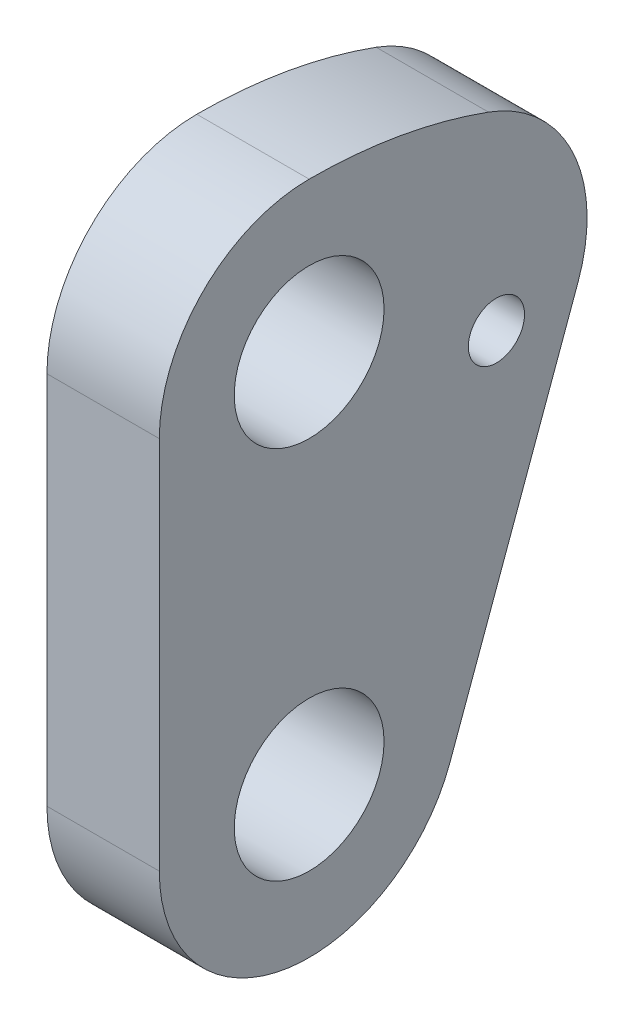
ISO-10303-21;
HEADER;
FILE_DESCRIPTION(('STEP AP214'),'2;1');
FILE_NAME('part.step','',(''),(''),'','','');
FILE_SCHEMA(('AUTOMOTIVE_DESIGN { 1 0 10303 214 1 1 1 1 }'));
ENDSEC;
DATA;
#1=APPLICATION_CONTEXT('core data for automotive mechanical design processes');
#2=APPLICATION_PROTOCOL_DEFINITION('international standard','automotive_design',2000,#1);
#3=PRODUCT_CONTEXT('',#1,'mechanical');
#4=PRODUCT('Part','Part','',(#3));
#5=PRODUCT_RELATED_PRODUCT_CATEGORY('part','',(#4));
#6=PRODUCT_DEFINITION_FORMATION('','',#4);
#7=PRODUCT_DEFINITION_CONTEXT('part definition',#1,'design');
#8=PRODUCT_DEFINITION('design','',#6,#7);
#9=PRODUCT_DEFINITION_SHAPE('','',#8);
#10=(LENGTH_UNIT() NAMED_UNIT(*) SI_UNIT(.MILLI.,.METRE.));
#11=(NAMED_UNIT(*) PLANE_ANGLE_UNIT() SI_UNIT($,.RADIAN.));
#12=(NAMED_UNIT(*) SI_UNIT($,.STERADIAN.) SOLID_ANGLE_UNIT());
#13=UNCERTAINTY_MEASURE_WITH_UNIT(LENGTH_MEASURE(1.E-05),#10,'distance_accuracy_value','');
#14=(GEOMETRIC_REPRESENTATION_CONTEXT(3) GLOBAL_UNCERTAINTY_ASSIGNED_CONTEXT((#13)) GLOBAL_UNIT_ASSIGNED_CONTEXT((#10,
#11,#12)) REPRESENTATION_CONTEXT('',''));
#15=CARTESIAN_POINT('',(0.,0.,0.));
#16=DIRECTION('',(0.,0.,1.));
#17=DIRECTION('',(1.,0.,0.));
#18=AXIS2_PLACEMENT_3D('',#15,#16,#17);
#19=CARTESIAN_POINT('',(3.,9.39692620785908,-3.42020143325669));
#20=DIRECTION('',(1.,0.,0.));
#21=DIRECTION('',(0.,0.,-1.));
#22=AXIS2_PLACEMENT_3D('',#19,#20,#21);
#23=PLANE('',#22);
#24=CARTESIAN_POINT('',(3.,8.,-5.));
#25=DIRECTION('',(1.,0.,0.));
#26=DIRECTION('',(0.,0.,-1.));
#27=AXIS2_PLACEMENT_3D('',#24,#25,#26);
#28=CIRCLE('',#27,0.750000000000001);
#29=CARTESIAN_POINT('',(3.,8.,-5.75));
#30=VERTEX_POINT('',#29);
#31=EDGE_CURVE('E178',#30,#30,#28,.T.);
#32=ORIENTED_EDGE('',*,*,#31,.F.);
#33=EDGE_LOOP('',(#32));
#34=FACE_BOUND('',#33,.T.);
#35=CARTESIAN_POINT('',(3.,0.,0.));
#36=DIRECTION('',(1.,0.,0.));
#37=DIRECTION('',(0.,0.,-1.));
#38=AXIS2_PLACEMENT_3D('',#35,#36,#37);
#39=CIRCLE('',#38,2.);
#40=CARTESIAN_POINT('',(3.,0.,-2.));
#41=VERTEX_POINT('',#40);
#42=EDGE_CURVE('E121',#41,#41,#39,.T.);
#43=ORIENTED_EDGE('',*,*,#42,.F.);
#44=EDGE_LOOP('',(#43));
#45=FACE_BOUND('',#44,.T.);
#46=CARTESIAN_POINT('',(3.,9.39692620785908,-3.42020143325669));
#47=DIRECTION('',(1.,0.,0.));
#48=DIRECTION('',(0.,0.,-1.));
#49=AXIS2_PLACEMENT_3D('',#46,#47,#48);
#50=CIRCLE('',#49,4.);
#51=CARTESIAN_POINT('',(3.,8.0288456345564,-7.17897191640033));
#52=VERTEX_POINT('',#51);
#53=CARTESIAN_POINT('',(3.,13.1556966910027,-4.78828200655937));
#54=VERTEX_POINT('',#53);
#55=EDGE_CURVE('E128',#52,#54,#50,.T.);
#56=ORIENTED_EDGE('',*,*,#55,.T.);
#57=CARTESIAN_POINT('',(3.,0.,0.));
#58=DIRECTION('',(1.,0.,0.));
#59=DIRECTION('',(0.,0.,1.));
#60=AXIS2_PLACEMENT_3D('',#57,#58,#59);
#61=CIRCLE('',#60,14.);
#62=CARTESIAN_POINT('',(3.,14.,0.));
#63=VERTEX_POINT('',#62);
#64=EDGE_CURVE('E86',#54,#63,#61,.T.);
#65=ORIENTED_EDGE('',*,*,#64,.T.);
#66=CARTESIAN_POINT('',(3.,10.,0.));
#67=DIRECTION('',(1.,0.,0.));
#68=DIRECTION('',(0.,0.,-1.));
#69=AXIS2_PLACEMENT_3D('',#66,#67,#68);
#70=CIRCLE('',#69,4.);
#71=CARTESIAN_POINT('',(3.,10.,4.));
#72=VERTEX_POINT('',#71);
#73=EDGE_CURVE('E99',#63,#72,#70,.T.);
#74=ORIENTED_EDGE('',*,*,#73,.T.);
#75=DIRECTION('',(0.,-1.,0.));
#76=VECTOR('',#75,1.);
#77=CARTESIAN_POINT('',(3.,10.,4.));
#78=LINE('',#77,#76);
#79=CARTESIAN_POINT('',(3.,0.,4.));
#80=VERTEX_POINT('',#79);
#81=EDGE_CURVE('E93',#72,#80,#78,.T.);
#82=ORIENTED_EDGE('',*,*,#81,.T.);
#83=CARTESIAN_POINT('',(3.,0.,0.));
#84=DIRECTION('',(1.,0.,0.));
#85=DIRECTION('',(0.,0.,-1.));
#86=AXIS2_PLACEMENT_3D('',#83,#84,#85);
#87=CIRCLE('',#86,4.);
#88=CARTESIAN_POINT('',(3.,-1.36808057330268,-3.75877048314363));
#89=VERTEX_POINT('',#88);
#90=EDGE_CURVE('E97',#80,#89,#87,.T.);
#91=ORIENTED_EDGE('',*,*,#90,.T.);
#92=DIRECTION('',(0.,0.939692620785908,-0.342020143325669));
#93=VECTOR('',#92,1.);
#94=CARTESIAN_POINT('',(3.,-1.36808057330268,-3.75877048314363));
#95=LINE('',#94,#93);
#96=EDGE_CURVE('E49',#89,#52,#95,.T.);
#97=ORIENTED_EDGE('',*,*,#96,.T.);
#98=EDGE_LOOP('',(#56,#65,#74,#82,#91,#97));
#99=FACE_BOUND('',#98,.T.);
#100=CARTESIAN_POINT('',(3.,10.,0.));
#101=DIRECTION('',(1.,0.,0.));
#102=DIRECTION('',(0.,0.,-1.));
#103=AXIS2_PLACEMENT_3D('',#100,#101,#102);
#104=CIRCLE('',#103,2.);
#105=CARTESIAN_POINT('',(3.,10.,-2.));
#106=VERTEX_POINT('',#105);
#107=EDGE_CURVE('E183',#106,#106,#104,.T.);
#108=ORIENTED_EDGE('',*,*,#107,.F.);
#109=EDGE_LOOP('',(#108));
#110=FACE_BOUND('',#109,.T.);
#111=ADVANCED_FACE('F32',(#34,#45,#99,#110),#23,.T.);
#112=CARTESIAN_POINT('',(0.,9.39692620785908,-3.42020143325669));
#113=DIRECTION('',(1.,0.,0.));
#114=DIRECTION('',(0.,0.,-1.));
#115=AXIS2_PLACEMENT_3D('',#112,#113,#114);
#116=PLANE('',#115);
#117=CARTESIAN_POINT('',(0.,8.,-5.));
#118=DIRECTION('',(1.,0.,0.));
#119=DIRECTION('',(0.,0.,-1.));
#120=AXIS2_PLACEMENT_3D('',#117,#118,#119);
#121=CIRCLE('',#120,0.750000000000001);
#122=CARTESIAN_POINT('',(0.,8.,-5.75));
#123=VERTEX_POINT('',#122);
#124=EDGE_CURVE('E176',#123,#123,#121,.T.);
#125=ORIENTED_EDGE('',*,*,#124,.T.);
#126=EDGE_LOOP('',(#125));
#127=FACE_BOUND('',#126,.T.);
#128=CARTESIAN_POINT('',(0.,0.,0.));
#129=DIRECTION('',(1.,0.,0.));
#130=DIRECTION('',(0.,0.,-1.));
#131=AXIS2_PLACEMENT_3D('',#128,#129,#130);
#132=CIRCLE('',#131,2.);
#133=CARTESIAN_POINT('',(0.,0.,-2.));
#134=VERTEX_POINT('',#133);
#135=EDGE_CURVE('E186',#134,#134,#132,.T.);
#136=ORIENTED_EDGE('',*,*,#135,.T.);
#137=EDGE_LOOP('',(#136));
#138=FACE_BOUND('',#137,.T.);
#139=CARTESIAN_POINT('',(0.,9.39692620785908,-3.42020143325669));
#140=DIRECTION('',(1.,0.,0.));
#141=DIRECTION('',(0.,0.,-1.));
#142=AXIS2_PLACEMENT_3D('',#139,#140,#141);
#143=CIRCLE('',#142,4.);
#144=CARTESIAN_POINT('',(0.,8.0288456345564,-7.17897191640033));
#145=VERTEX_POINT('',#144);
#146=CARTESIAN_POINT('',(0.,13.1556966910027,-4.78828200655937));
#147=VERTEX_POINT('',#146);
#148=EDGE_CURVE('E117',#145,#147,#143,.T.);
#149=ORIENTED_EDGE('',*,*,#148,.F.);
#150=DIRECTION('',(0.,0.939692620785908,-0.342020143325669));
#151=VECTOR('',#150,1.);
#152=CARTESIAN_POINT('',(0.,-1.36808057330268,-3.75877048314363));
#153=LINE('',#152,#151);
#154=CARTESIAN_POINT('',(0.,-1.36808057330268,-3.75877048314363));
#155=VERTEX_POINT('',#154);
#156=EDGE_CURVE('E78',#155,#145,#153,.T.);
#157=ORIENTED_EDGE('',*,*,#156,.F.);
#158=CARTESIAN_POINT('',(0.,0.,0.));
#159=DIRECTION('',(1.,0.,0.));
#160=DIRECTION('',(0.,0.,-1.));
#161=AXIS2_PLACEMENT_3D('',#158,#159,#160);
#162=CIRCLE('',#161,4.);
#163=CARTESIAN_POINT('',(0.,0.,4.));
#164=VERTEX_POINT('',#163);
#165=EDGE_CURVE('E72',#164,#155,#162,.T.);
#166=ORIENTED_EDGE('',*,*,#165,.F.);
#167=DIRECTION('',(0.,-1.,0.));
#168=VECTOR('',#167,1.);
#169=CARTESIAN_POINT('',(0.,10.,4.));
#170=LINE('',#169,#168);
#171=CARTESIAN_POINT('',(0.,10.,4.));
#172=VERTEX_POINT('',#171);
#173=EDGE_CURVE('E107',#172,#164,#170,.T.);
#174=ORIENTED_EDGE('',*,*,#173,.F.);
#175=CARTESIAN_POINT('',(0.,10.,0.));
#176=DIRECTION('',(1.,0.,0.));
#177=DIRECTION('',(0.,0.,-1.));
#178=AXIS2_PLACEMENT_3D('',#175,#176,#177);
#179=CIRCLE('',#178,4.);
#180=CARTESIAN_POINT('',(0.,14.,0.));
#181=VERTEX_POINT('',#180);
#182=EDGE_CURVE('E123',#181,#172,#179,.T.);
#183=ORIENTED_EDGE('',*,*,#182,.F.);
#184=CARTESIAN_POINT('',(0.,0.,0.));
#185=DIRECTION('',(1.,0.,0.));
#186=DIRECTION('',(0.,0.,1.));
#187=AXIS2_PLACEMENT_3D('',#184,#185,#186);
#188=CIRCLE('',#187,14.);
#189=EDGE_CURVE('E120',#147,#181,#188,.T.);
#190=ORIENTED_EDGE('',*,*,#189,.F.);
#191=EDGE_LOOP('',(#149,#157,#166,#174,#183,#190));
#192=FACE_BOUND('',#191,.T.);
#193=CARTESIAN_POINT('',(0.,10.,0.));
#194=DIRECTION('',(1.,0.,0.));
#195=DIRECTION('',(0.,0.,-1.));
#196=AXIS2_PLACEMENT_3D('',#193,#194,#195);
#197=CIRCLE('',#196,2.);
#198=CARTESIAN_POINT('',(0.,10.,-2.));
#199=VERTEX_POINT('',#198);
#200=EDGE_CURVE('E180',#199,#199,#197,.T.);
#201=ORIENTED_EDGE('',*,*,#200,.T.);
#202=EDGE_LOOP('',(#201));
#203=FACE_BOUND('',#202,.T.);
#204=ADVANCED_FACE('F137',(#127,#138,#192,#203),#116,.F.);
#205=CARTESIAN_POINT('',(3.,9.39692620785908,-3.42020143325669));
#206=DIRECTION('',(-1.,0.,0.));
#207=DIRECTION('',(0.,0.,1.));
#208=AXIS2_PLACEMENT_3D('',#205,#206,#207);
#209=CYLINDRICAL_SURFACE('',#208,4.);
#210=ORIENTED_EDGE('',*,*,#148,.T.);
#211=DIRECTION('',(-1.,0.,0.));
#212=VECTOR('',#211,1.);
#213=CARTESIAN_POINT('',(3.,13.1556966910027,-4.78828200655937));
#214=LINE('',#213,#212);
#215=EDGE_CURVE('E11',#54,#147,#214,.T.);
#216=ORIENTED_EDGE('',*,*,#215,.F.);
#217=ORIENTED_EDGE('',*,*,#55,.F.);
#218=DIRECTION('',(-1.,0.,0.));
#219=VECTOR('',#218,1.);
#220=CARTESIAN_POINT('',(3.,8.0288456345564,-7.17897191640033));
#221=LINE('',#220,#219);
#222=EDGE_CURVE('E113',#52,#145,#221,.T.);
#223=ORIENTED_EDGE('',*,*,#222,.T.);
#224=EDGE_LOOP('',(#210,#216,#217,#223));
#225=FACE_BOUND('',#224,.T.);
#226=ADVANCED_FACE('F34',(#225),#209,.T.);
#227=CARTESIAN_POINT('',(3.,0.,0.));
#228=DIRECTION('',(-1.,0.,0.));
#229=DIRECTION('',(0.,0.,1.));
#230=AXIS2_PLACEMENT_3D('',#227,#228,#229);
#231=CYLINDRICAL_SURFACE('',#230,14.);
#232=ORIENTED_EDGE('',*,*,#189,.T.);
#233=DIRECTION('',(-1.,0.,0.));
#234=VECTOR('',#233,1.);
#235=CARTESIAN_POINT('',(3.,14.,0.));
#236=LINE('',#235,#234);
#237=EDGE_CURVE('E41',#63,#181,#236,.T.);
#238=ORIENTED_EDGE('',*,*,#237,.F.);
#239=ORIENTED_EDGE('',*,*,#64,.F.);
#240=ORIENTED_EDGE('',*,*,#215,.T.);
#241=EDGE_LOOP('',(#232,#238,#239,#240));
#242=FACE_BOUND('',#241,.T.);
#243=ADVANCED_FACE('F237',(#242),#231,.T.);
#244=CARTESIAN_POINT('',(3.,10.,0.));
#245=DIRECTION('',(-1.,0.,0.));
#246=DIRECTION('',(0.,0.,1.));
#247=AXIS2_PLACEMENT_3D('',#244,#245,#246);
#248=CYLINDRICAL_SURFACE('',#247,4.);
#249=ORIENTED_EDGE('',*,*,#182,.T.);
#250=DIRECTION('',(-1.,0.,0.));
#251=VECTOR('',#250,1.);
#252=CARTESIAN_POINT('',(3.,10.,4.));
#253=LINE('',#252,#251);
#254=EDGE_CURVE('E108',#72,#172,#253,.T.);
#255=ORIENTED_EDGE('',*,*,#254,.F.);
#256=ORIENTED_EDGE('',*,*,#73,.F.);
#257=ORIENTED_EDGE('',*,*,#237,.T.);
#258=EDGE_LOOP('',(#249,#255,#256,#257));
#259=FACE_BOUND('',#258,.T.);
#260=ADVANCED_FACE('F134',(#259),#248,.T.);
#261=CARTESIAN_POINT('',(3.,10.,4.));
#262=DIRECTION('',(0.,0.,-1.));
#263=DIRECTION('',(0.,1.,0.));
#264=AXIS2_PLACEMENT_3D('',#261,#262,#263);
#265=PLANE('',#264);
#266=ORIENTED_EDGE('',*,*,#173,.T.);
#267=DIRECTION('',(-1.,0.,0.));
#268=VECTOR('',#267,1.);
#269=CARTESIAN_POINT('',(3.,0.,4.));
#270=LINE('',#269,#268);
#271=EDGE_CURVE('E104',#80,#164,#270,.T.);
#272=ORIENTED_EDGE('',*,*,#271,.F.);
#273=ORIENTED_EDGE('',*,*,#81,.F.);
#274=ORIENTED_EDGE('',*,*,#254,.T.);
#275=EDGE_LOOP('',(#266,#272,#273,#274));
#276=FACE_BOUND('',#275,.T.);
#277=ADVANCED_FACE('F105',(#276),#265,.F.);
#278=CARTESIAN_POINT('',(3.,0.,0.));
#279=DIRECTION('',(-1.,0.,0.));
#280=DIRECTION('',(0.,0.,1.));
#281=AXIS2_PLACEMENT_3D('',#278,#279,#280);
#282=CYLINDRICAL_SURFACE('',#281,4.);
#283=ORIENTED_EDGE('',*,*,#165,.T.);
#284=DIRECTION('',(-1.,0.,0.));
#285=VECTOR('',#284,1.);
#286=CARTESIAN_POINT('',(3.,-1.36808057330268,-3.75877048314363));
#287=LINE('',#286,#285);
#288=EDGE_CURVE('E109',#89,#155,#287,.T.);
#289=ORIENTED_EDGE('',*,*,#288,.F.);
#290=ORIENTED_EDGE('',*,*,#90,.F.);
#291=ORIENTED_EDGE('',*,*,#271,.T.);
#292=EDGE_LOOP('',(#283,#289,#290,#291));
#293=FACE_BOUND('',#292,.T.);
#294=ADVANCED_FACE('F111',(#293),#282,.T.);
#295=CARTESIAN_POINT('',(3.,-1.36808057330268,-3.75877048314363));
#296=DIRECTION('',(0.,0.342020143325669,0.939692620785908));
#297=DIRECTION('',(0.,-0.939692620785908,0.342020143325669));
#298=AXIS2_PLACEMENT_3D('',#295,#296,#297);
#299=PLANE('',#298);
#300=ORIENTED_EDGE('',*,*,#156,.T.);
#301=ORIENTED_EDGE('',*,*,#222,.F.);
#302=ORIENTED_EDGE('',*,*,#96,.F.);
#303=ORIENTED_EDGE('',*,*,#288,.T.);
#304=EDGE_LOOP('',(#300,#301,#302,#303));
#305=FACE_BOUND('',#304,.T.);
#306=ADVANCED_FACE('F142',(#305),#299,.F.);
#307=CARTESIAN_POINT('',(3.,0.,0.));
#308=DIRECTION('',(-1.,0.,0.));
#309=DIRECTION('',(0.,0.,1.));
#310=AXIS2_PLACEMENT_3D('',#307,#308,#309);
#311=CYLINDRICAL_SURFACE('',#310,2.);
#312=ORIENTED_EDGE('',*,*,#42,.T.);
#313=EDGE_LOOP('',(#312));
#314=FACE_BOUND('',#313,.T.);
#315=ORIENTED_EDGE('',*,*,#135,.F.);
#316=EDGE_LOOP('',(#315));
#317=FACE_BOUND('',#316,.T.);
#318=ADVANCED_FACE('F144',(#314,#317),#311,.F.);
#319=CARTESIAN_POINT('',(3.,10.,0.));
#320=DIRECTION('',(-1.,0.,0.));
#321=DIRECTION('',(0.,0.,1.));
#322=AXIS2_PLACEMENT_3D('',#319,#320,#321);
#323=CYLINDRICAL_SURFACE('',#322,2.);
#324=ORIENTED_EDGE('',*,*,#107,.T.);
#325=EDGE_LOOP('',(#324));
#326=FACE_BOUND('',#325,.T.);
#327=ORIENTED_EDGE('',*,*,#200,.F.);
#328=EDGE_LOOP('',(#327));
#329=FACE_BOUND('',#328,.T.);
#330=ADVANCED_FACE('F150',(#326,#329),#323,.F.);
#331=CARTESIAN_POINT('',(0.,8.,-5.));
#332=DIRECTION('',(1.,0.,0.));
#333=DIRECTION('',(0.,0.,-1.));
#334=AXIS2_PLACEMENT_3D('',#331,#332,#333);
#335=CYLINDRICAL_SURFACE('',#334,0.750000000000001);
#336=ORIENTED_EDGE('',*,*,#124,.F.);
#337=EDGE_LOOP('',(#336));
#338=FACE_BOUND('',#337,.T.);
#339=ORIENTED_EDGE('',*,*,#31,.T.);
#340=EDGE_LOOP('',(#339));
#341=FACE_BOUND('',#340,.T.);
#342=ADVANCED_FACE('F167',(#338,#341),#335,.F.);
#343=CLOSED_SHELL('',(#111,#204,#226,#243,#260,#277,#294,#306,#318,#330,#342));
#344=MANIFOLD_SOLID_BREP('B2',#343);
#345=ADVANCED_BREP_SHAPE_REPRESENTATION('',(#18,#344),#14);
#346=SHAPE_DEFINITION_REPRESENTATION(#9,#345);
ENDSEC;
END-ISO-10303-21;
